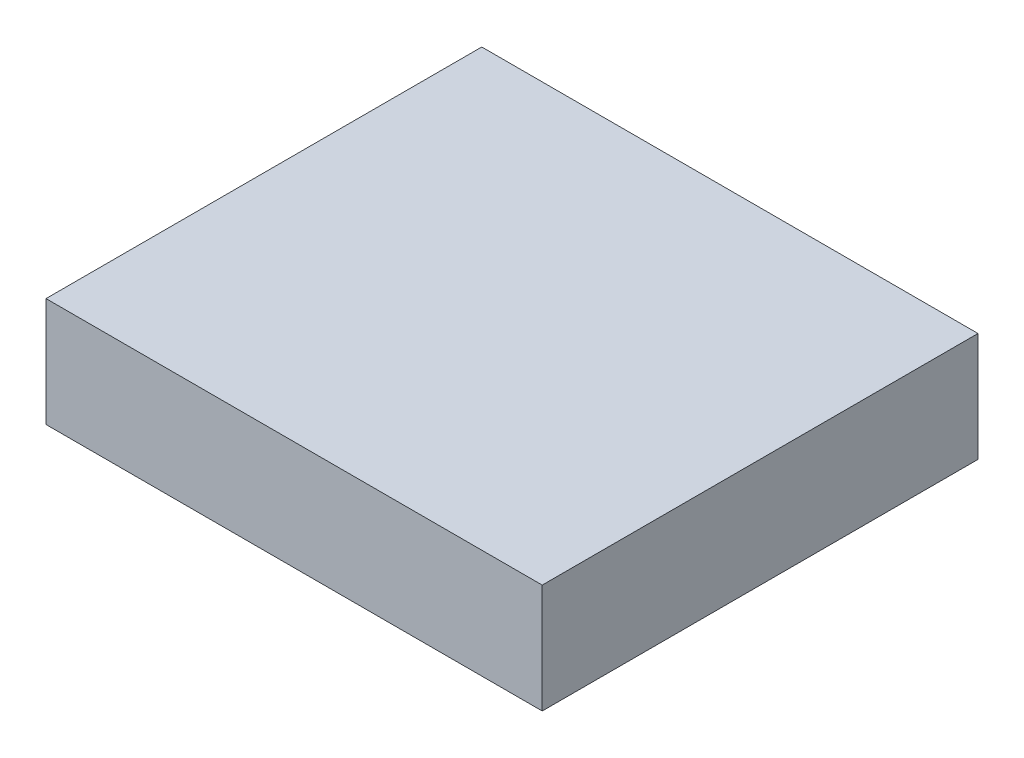
ISO-10303-21;
HEADER;
FILE_DESCRIPTION(('STEP AP214'),'2;1');
FILE_NAME('part.step','',(''),(''),'','','');
FILE_SCHEMA(('AUTOMOTIVE_DESIGN { 1 0 10303 214 1 1 1 1 }'));
ENDSEC;
DATA;
#1=APPLICATION_CONTEXT('core data for automotive mechanical design processes');
#2=APPLICATION_PROTOCOL_DEFINITION('international standard','automotive_design',2000,#1);
#3=PRODUCT_CONTEXT('',#1,'mechanical');
#4=PRODUCT('Part','Part','',(#3));
#5=PRODUCT_RELATED_PRODUCT_CATEGORY('part','',(#4));
#6=PRODUCT_DEFINITION_FORMATION('','',#4);
#7=PRODUCT_DEFINITION_CONTEXT('part definition',#1,'design');
#8=PRODUCT_DEFINITION('design','',#6,#7);
#9=PRODUCT_DEFINITION_SHAPE('','',#8);
#10=(LENGTH_UNIT() NAMED_UNIT(*) SI_UNIT(.MILLI.,.METRE.));
#11=(NAMED_UNIT(*) PLANE_ANGLE_UNIT() SI_UNIT($,.RADIAN.));
#12=(NAMED_UNIT(*) SI_UNIT($,.STERADIAN.) SOLID_ANGLE_UNIT());
#13=UNCERTAINTY_MEASURE_WITH_UNIT(LENGTH_MEASURE(1.E-05),#10,'distance_accuracy_value','');
#14=(GEOMETRIC_REPRESENTATION_CONTEXT(3) GLOBAL_UNCERTAINTY_ASSIGNED_CONTEXT((#13)) GLOBAL_UNIT_ASSIGNED_CONTEXT((#10,
#11,#12)) REPRESENTATION_CONTEXT('',''));
#15=CARTESIAN_POINT('',(0.,0.,0.));
#16=DIRECTION('',(0.,0.,1.));
#17=DIRECTION('',(1.,0.,0.));
#18=AXIS2_PLACEMENT_3D('',#15,#16,#17);
#19=CARTESIAN_POINT('',(0.,1.09982,0.));
#20=DIRECTION('',(1.,0.,0.));
#21=DIRECTION('',(0.,0.,-1.));
#22=AXIS2_PLACEMENT_3D('',#19,#20,#21);
#23=PLANE('',#22);
#24=DIRECTION('',(0.,0.,1.));
#25=VECTOR('',#24,1.);
#26=CARTESIAN_POINT('',(0.,0.,0.));
#27=LINE('',#26,#25);
#28=CARTESIAN_POINT('',(0.,0.,-4.3942));
#29=VERTEX_POINT('',#28);
#30=CARTESIAN_POINT('',(0.,0.,0.));
#31=VERTEX_POINT('',#30);
#32=EDGE_CURVE('E96',#29,#31,#27,.T.);
#33=ORIENTED_EDGE('',*,*,#32,.T.);
#34=DIRECTION('',(0.,-1.,0.));
#35=VECTOR('',#34,1.);
#36=CARTESIAN_POINT('',(0.,1.09982,0.));
#37=LINE('',#36,#35);
#38=CARTESIAN_POINT('',(0.,1.09982,0.));
#39=VERTEX_POINT('',#38);
#40=EDGE_CURVE('E11',#39,#31,#37,.T.);
#41=ORIENTED_EDGE('',*,*,#40,.F.);
#42=DIRECTION('',(0.,0.,1.));
#43=VECTOR('',#42,1.);
#44=CARTESIAN_POINT('',(0.,1.09982,0.));
#45=LINE('',#44,#43);
#46=CARTESIAN_POINT('',(0.,1.09982,-4.3942));
#47=VERTEX_POINT('',#46);
#48=EDGE_CURVE('E84',#47,#39,#45,.T.);
#49=ORIENTED_EDGE('',*,*,#48,.F.);
#50=DIRECTION('',(0.,-1.,0.));
#51=VECTOR('',#50,1.);
#52=CARTESIAN_POINT('',(0.,1.09982,-4.3942));
#53=LINE('',#52,#51);
#54=EDGE_CURVE('E92',#47,#29,#53,.T.);
#55=ORIENTED_EDGE('',*,*,#54,.T.);
#56=EDGE_LOOP('',(#33,#41,#49,#55));
#57=FACE_BOUND('',#56,.T.);
#58=ADVANCED_FACE('F33',(#57),#23,.F.);
#59=CARTESIAN_POINT('',(0.,1.09982,0.));
#60=DIRECTION('',(0.,0.,-1.));
#61=DIRECTION('',(-1.,0.,0.));
#62=AXIS2_PLACEMENT_3D('',#59,#60,#61);
#63=PLANE('',#62);
#64=DIRECTION('',(1.,0.,0.));
#65=VECTOR('',#64,1.);
#66=CARTESIAN_POINT('',(0.,0.,0.));
#67=LINE('',#66,#65);
#68=CARTESIAN_POINT('',(5.0038,0.,0.));
#69=VERTEX_POINT('',#68);
#70=EDGE_CURVE('E88',#31,#69,#67,.T.);
#71=ORIENTED_EDGE('',*,*,#70,.T.);
#72=DIRECTION('',(0.,-1.,0.));
#73=VECTOR('',#72,1.);
#74=CARTESIAN_POINT('',(5.0038,1.09982,0.));
#75=LINE('',#74,#73);
#76=CARTESIAN_POINT('',(5.0038,1.09982,0.));
#77=VERTEX_POINT('',#76);
#78=EDGE_CURVE('E41',#77,#69,#75,.T.);
#79=ORIENTED_EDGE('',*,*,#78,.F.);
#80=DIRECTION('',(1.,0.,0.));
#81=VECTOR('',#80,1.);
#82=CARTESIAN_POINT('',(0.,1.09982,0.));
#83=LINE('',#82,#81);
#84=EDGE_CURVE('E79',#39,#77,#83,.T.);
#85=ORIENTED_EDGE('',*,*,#84,.F.);
#86=ORIENTED_EDGE('',*,*,#40,.T.);
#87=EDGE_LOOP('',(#71,#79,#85,#86));
#88=FACE_BOUND('',#87,.T.);
#89=ADVANCED_FACE('F87',(#88),#63,.F.);
#90=CARTESIAN_POINT('',(5.0038,1.09982,0.));
#91=DIRECTION('',(-1.,0.,0.));
#92=DIRECTION('',(0.,0.,1.));
#93=AXIS2_PLACEMENT_3D('',#90,#91,#92);
#94=PLANE('',#93);
#95=DIRECTION('',(0.,0.,-1.));
#96=VECTOR('',#95,1.);
#97=CARTESIAN_POINT('',(5.0038,0.,0.));
#98=LINE('',#97,#96);
#99=CARTESIAN_POINT('',(5.0038,0.,-4.3942));
#100=VERTEX_POINT('',#99);
#101=EDGE_CURVE('E66',#69,#100,#98,.T.);
#102=ORIENTED_EDGE('',*,*,#101,.T.);
#103=DIRECTION('',(0.,-1.,0.));
#104=VECTOR('',#103,1.);
#105=CARTESIAN_POINT('',(5.0038,1.09982,-4.3942));
#106=LINE('',#105,#104);
#107=CARTESIAN_POINT('',(5.0038,1.09982,-4.3942));
#108=VERTEX_POINT('',#107);
#109=EDGE_CURVE('E89',#108,#100,#106,.T.);
#110=ORIENTED_EDGE('',*,*,#109,.F.);
#111=DIRECTION('',(0.,0.,-1.));
#112=VECTOR('',#111,1.);
#113=CARTESIAN_POINT('',(5.0038,1.09982,0.));
#114=LINE('',#113,#112);
#115=EDGE_CURVE('E82',#77,#108,#114,.T.);
#116=ORIENTED_EDGE('',*,*,#115,.F.);
#117=ORIENTED_EDGE('',*,*,#78,.T.);
#118=EDGE_LOOP('',(#102,#110,#116,#117));
#119=FACE_BOUND('',#118,.T.);
#120=ADVANCED_FACE('F90',(#119),#94,.F.);
#121=CARTESIAN_POINT('',(0.,1.09982,-4.3942));
#122=DIRECTION('',(0.,0.,1.));
#123=DIRECTION('',(1.,0.,0.));
#124=AXIS2_PLACEMENT_3D('',#121,#122,#123);
#125=PLANE('',#124);
#126=DIRECTION('',(-1.,0.,0.));
#127=VECTOR('',#126,1.);
#128=CARTESIAN_POINT('',(0.,0.,-4.3942));
#129=LINE('',#128,#127);
#130=EDGE_CURVE('E72',#100,#29,#129,.T.);
#131=ORIENTED_EDGE('',*,*,#130,.T.);
#132=ORIENTED_EDGE('',*,*,#54,.F.);
#133=DIRECTION('',(-1.,0.,0.));
#134=VECTOR('',#133,1.);
#135=CARTESIAN_POINT('',(0.,1.09982,-4.3942));
#136=LINE('',#135,#134);
#137=EDGE_CURVE('E49',#108,#47,#136,.T.);
#138=ORIENTED_EDGE('',*,*,#137,.F.);
#139=ORIENTED_EDGE('',*,*,#109,.T.);
#140=EDGE_LOOP('',(#131,#132,#138,#139));
#141=FACE_BOUND('',#140,.T.);
#142=ADVANCED_FACE('F103',(#141),#125,.F.);
#143=CARTESIAN_POINT('',(0.,1.09982,0.));
#144=DIRECTION('',(0.,-1.,0.));
#145=DIRECTION('',(0.,0.,-1.));
#146=AXIS2_PLACEMENT_3D('',#143,#144,#145);
#147=PLANE('',#146);
#148=ORIENTED_EDGE('',*,*,#48,.T.);
#149=ORIENTED_EDGE('',*,*,#84,.T.);
#150=ORIENTED_EDGE('',*,*,#115,.T.);
#151=ORIENTED_EDGE('',*,*,#137,.T.);
#152=EDGE_LOOP('',(#148,#149,#150,#151));
#153=FACE_BOUND('',#152,.T.);
#154=ADVANCED_FACE('F80',(#153),#147,.F.);
#155=CARTESIAN_POINT('',(0.,0.,0.));
#156=DIRECTION('',(0.,-1.,0.));
#157=DIRECTION('',(0.,0.,-1.));
#158=AXIS2_PLACEMENT_3D('',#155,#156,#157);
#159=PLANE('',#158);
#160=ORIENTED_EDGE('',*,*,#32,.F.);
#161=ORIENTED_EDGE('',*,*,#130,.F.);
#162=ORIENTED_EDGE('',*,*,#101,.F.);
#163=ORIENTED_EDGE('',*,*,#70,.F.);
#164=EDGE_LOOP('',(#160,#161,#162,#163));
#165=FACE_BOUND('',#164,.T.);
#166=ADVANCED_FACE('F106',(#165),#159,.T.);
#167=CLOSED_SHELL('',(#58,#89,#120,#142,#154,#166));
#168=MANIFOLD_SOLID_BREP('B2',#167);
#169=ADVANCED_BREP_SHAPE_REPRESENTATION('',(#18,#168),#14);
#170=SHAPE_DEFINITION_REPRESENTATION(#9,#169);
ENDSEC;
END-ISO-10303-21;
